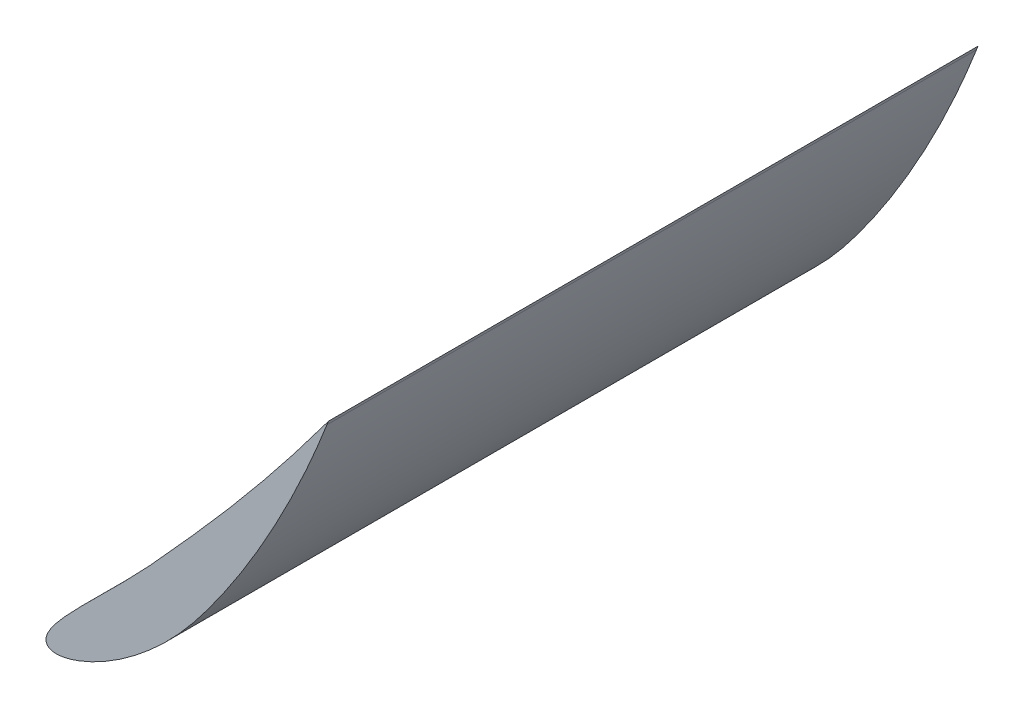
ISO-10303-21;
HEADER;
FILE_DESCRIPTION(('STEP AP214'),'2;1');
FILE_NAME('part.step','',(''),(''),'','','');
FILE_SCHEMA(('AUTOMOTIVE_DESIGN { 1 0 10303 214 1 1 1 1 }'));
ENDSEC;
DATA;
#1=APPLICATION_CONTEXT('core data for automotive mechanical design processes');
#2=APPLICATION_PROTOCOL_DEFINITION('international standard','automotive_design',2000,#1);
#3=PRODUCT_CONTEXT('',#1,'mechanical');
#4=PRODUCT('Part','Part','',(#3));
#5=PRODUCT_RELATED_PRODUCT_CATEGORY('part','',(#4));
#6=PRODUCT_DEFINITION_FORMATION('','',#4);
#7=PRODUCT_DEFINITION_CONTEXT('part definition',#1,'design');
#8=PRODUCT_DEFINITION('design','',#6,#7);
#9=PRODUCT_DEFINITION_SHAPE('','',#8);
#10=(LENGTH_UNIT() NAMED_UNIT(*) SI_UNIT(.MILLI.,.METRE.));
#11=(NAMED_UNIT(*) PLANE_ANGLE_UNIT() SI_UNIT($,.RADIAN.));
#12=(NAMED_UNIT(*) SI_UNIT($,.STERADIAN.) SOLID_ANGLE_UNIT());
#13=UNCERTAINTY_MEASURE_WITH_UNIT(LENGTH_MEASURE(1.E-05),#10,'distance_accuracy_value','');
#14=(GEOMETRIC_REPRESENTATION_CONTEXT(3) GLOBAL_UNCERTAINTY_ASSIGNED_CONTEXT((#13)) GLOBAL_UNIT_ASSIGNED_CONTEXT((#10,
#11,#12)) REPRESENTATION_CONTEXT('',''));
#15=CARTESIAN_POINT('',(0.,0.,0.));
#16=DIRECTION('',(0.,0.,1.));
#17=DIRECTION('',(1.,0.,0.));
#18=AXIS2_PLACEMENT_3D('',#15,#16,#17);
#19=CARTESIAN_POINT('',(97.8137332136656,116.86860343058,228.6));
#20=CARTESIAN_POINT('',(97.7669992183084,116.805627113996,228.6));
#21=CARTESIAN_POINT('',(97.5803130026046,116.554058419059,228.6));
#22=CARTESIAN_POINT('',(97.1607888126259,115.989952744268,228.6));
#23=CARTESIAN_POINT('',(96.4639961396961,115.054026865066,228.6));
#24=CARTESIAN_POINT('',(95.4924542969306,113.753595867812,228.6));
#25=CARTESIAN_POINT('',(94.2504202583417,112.098040238544,228.6));
#26=CARTESIAN_POINT('',(92.7432066996339,110.099612909975,228.6));
#27=CARTESIAN_POINT('',(90.9767786409202,107.773302857194,228.6));
#28=CARTESIAN_POINT('',(88.9590425455821,105.13610890942,228.6));
#29=CARTESIAN_POINT('',(86.6981707568239,102.207726841175,228.6));
#30=CARTESIAN_POINT('',(84.2043740518763,99.0094529713091,228.6));
#31=CARTESIAN_POINT('',(81.4879419079242,95.565167312813,228.6));
#32=CARTESIAN_POINT('',(78.5616527284862,91.8994504311578,228.6));
#33=CARTESIAN_POINT('',(75.4390835388548,88.0386280973165,228.6));
#34=CARTESIAN_POINT('',(72.135956401896,84.0095087757725,228.6));
#35=CARTESIAN_POINT('',(68.6688047216238,79.8401309149492,228.6));
#36=CARTESIAN_POINT('',(65.0573201930824,75.5576970940226,228.6));
#37=CARTESIAN_POINT('',(61.3219555140707,71.190023639292,228.6));
#38=CARTESIAN_POINT('',(57.4858546977625,66.7641429466457,228.6));
#39=CARTESIAN_POINT('',(53.5742219118697,62.3058591382801,228.6));
#40=CARTESIAN_POINT('',(49.6131051147125,57.8411879676059,228.6));
#41=CARTESIAN_POINT('',(45.6322591512687,53.3930893948024,228.6));
#42=CARTESIAN_POINT('',(41.6581598168508,48.9874868580185,228.6));
#43=CARTESIAN_POINT('',(37.7324465764052,44.6347432817589,228.6));
#44=CARTESIAN_POINT('',(33.8059814126913,40.4269731275683,228.6));
#45=CARTESIAN_POINT('',(29.9195610664221,36.3755477990785,228.6));
#46=CARTESIAN_POINT('',(26.1101536055358,32.4940809014098,228.6));
#47=CARTESIAN_POINT('',(22.4167278468271,28.7935103404381,228.6));
#48=CARTESIAN_POINT('',(18.8777043655426,25.2834160077278,228.6));
#49=CARTESIAN_POINT('',(15.5312873300869,21.9715325768351,228.6));
#50=CARTESIAN_POINT('',(12.4136528103556,18.8650991681408,228.6));
#51=CARTESIAN_POINT('',(9.55974300948811,15.9697374300727,228.6));
#52=CARTESIAN_POINT('',(7.00077432910496,13.2915183648732,228.6));
#53=CARTESIAN_POINT('',(4.76616148462841,10.8348916844291,228.6));
#54=CARTESIAN_POINT('',(2.88073522590203,8.60445058371188,228.6));
#55=CARTESIAN_POINT('',(1.36554493937061,6.60374765790339,228.6));
#56=CARTESIAN_POINT('',(0.236182588741622,4.83424953486331,228.6));
#57=CARTESIAN_POINT('',(-0.495963941615334,3.29145994512534,228.6));
#58=CARTESIAN_POINT('',(-0.826333115795017,1.9584743241363,228.6));
#59=CARTESIAN_POINT('',(-0.694809938298505,0.792786703510852,228.6));
#60=CARTESIAN_POINT('',(-0.0160813713409521,-0.0981649626573972,228.6));
#61=CARTESIAN_POINT('',(1.07585694611111,-0.630099093502898,228.6));
#62=CARTESIAN_POINT('',(2.50794565187337,-0.84109171326829,228.6));
#63=CARTESIAN_POINT('',(4.27814833721603,-0.759421478664957,228.6));
#64=CARTESIAN_POINT('',(6.38579866183101,-0.384068927977449,228.6));
#65=CARTESIAN_POINT('',(8.81693628628207,0.290663380890077,228.6));
#66=CARTESIAN_POINT('',(11.5478362976383,1.27357542980017,228.6));
#67=CARTESIAN_POINT('',(14.5495578740381,2.57081595112599,228.6));
#68=CARTESIAN_POINT('',(17.7884314196016,4.18919057714553,228.6));
#69=CARTESIAN_POINT('',(21.2285346552186,6.13293180113872,228.6));
#70=CARTESIAN_POINT('',(24.8318117752578,8.40485229218982,228.6));
#71=CARTESIAN_POINT('',(28.5591963302505,11.0056857780069,228.6));
#72=CARTESIAN_POINT('',(32.3720543770746,13.9325804086768,228.6));
#73=CARTESIAN_POINT('',(36.2318466938443,17.1803834063919,228.6));
#74=CARTESIAN_POINT('',(40.1019091761925,20.7397133609309,228.6));
#75=CARTESIAN_POINT('',(43.9471804100853,24.5980510472107,228.6));
#76=CARTESIAN_POINT('',(47.7349891146487,28.7388033018524,228.6));
#77=CARTESIAN_POINT('',(51.4364840361321,33.1411797641945,228.6));
#78=CARTESIAN_POINT('',(55.0189078093856,37.7816381036581,228.6));
#79=CARTESIAN_POINT('',(58.5472398557344,42.5631470763992,228.6));
#80=CARTESIAN_POINT('',(61.991116763375,47.4634143463883,228.6));
#81=CARTESIAN_POINT('',(65.3365248146767,52.4460022002043,228.6));
#82=CARTESIAN_POINT('',(68.5669409219207,57.4767198642199,228.6));
#83=CARTESIAN_POINT('',(71.6693015705271,62.5188811781721,228.6));
#84=CARTESIAN_POINT('',(74.6304526730013,67.5364407267787,228.6));
#85=CARTESIAN_POINT('',(77.4395059683986,72.4921523557111,228.6));
#86=CARTESIAN_POINT('',(80.087304420646,77.3488244464799,228.6));
#87=CARTESIAN_POINT('',(82.5655590057878,82.0696260791285,228.6));
#88=CARTESIAN_POINT('',(84.8681215038335,86.6179564539699,228.6));
#89=CARTESIAN_POINT('',(86.9893839299676,90.9583718773948,228.6));
#90=CARTESIAN_POINT('',(88.9259407005482,95.056088101909,228.6));
#91=CARTESIAN_POINT('',(90.6758095415655,98.8776612718666,228.6));
#92=CARTESIAN_POINT('',(92.2371976177409,102.391824454854,228.6));
#93=CARTESIAN_POINT('',(93.6103190532152,105.568768693889,228.6));
#94=CARTESIAN_POINT('',(94.7958202235989,108.381383030425,228.6));
#95=CARTESIAN_POINT('',(95.794855225195,110.80513563709,228.6));
#96=CARTESIAN_POINT('',(96.6090036132774,112.818724881819,228.6));
#97=CARTESIAN_POINT('',(97.2400379340367,114.404059770635,228.6));
#98=CARTESIAN_POINT('',(97.6892738023378,115.547006234183,228.6));
#99=CARTESIAN_POINT('',(97.9585585127539,116.23685124781,228.6));
#100=CARTESIAN_POINT('',(98.078015040344,116.544659288396,228.6));
#101=CARTESIAN_POINT('',(98.1079302187929,116.621742832084,228.6));
#102=B_SPLINE_CURVE_WITH_KNOTS('',3,(#19,#20,#21,#22,#23,#24,#25,#26,#27,#28,#29,#30,#31,#32,
#33,#34,#35,#36,#37,#38,#39,#40,#41,#42,#43,#44,#45,#46,#47,#48,#49,#50,#51,#52,#53,#54,#55,#56,
#57,#58,#59,#60,#61,#62,#63,#64,#65,#66,#67,#68,#69,#70,#71,#72,#73,#74,#75,#76,#77,#78,#79,#80,
#81,#82,#83,#84,#85,#86,#87,#88,#89,#90,#91,#92,#93,#94,#95,#96,#97,#98,#99,#100,#101),
.UNSPECIFIED.,.F.,.F.,(4,1,1,1,1,1,1,1,1,1,1,1,1,1,1,1,1,1,1,1,1,1,1,1,1,1,1,1,1,1,1,1,1,1,1,1,
1,1,1,1,1,1,1,1,1,1,1,1,1,1,1,1,1,1,1,1,1,1,1,1,1,1,1,1,1,1,1,1,1,1,1,1,1,1,1,1,1,1,1,1,4),(0.,
0.000750513501971195,0.00299804295428685,0.00672784940377236,0.0119171706525508,
0.0185329713263098,0.026534805613309,0.0358719389384909,0.0464868619139933,0.0583128283132623,
0.0712773849994469,0.0852994283936014,0.100292782778247,0.116165673834452,0.132819784938735,
0.150153116370067,0.168060493162749,0.18643095732459,0.205153508431755,0.224112105695577,
0.243191419595248,0.262273248918981,0.281238994312411,0.299973133201852,0.318367875682616,
0.336314444831389,0.353699728178519,0.370414229508711,0.386350073996083,0.401402198899796,
0.415472291888822,0.428468847070347,0.440308267572275,0.450919872749776,0.460245935875565,
0.468249663818777,0.47492187606895,0.480303629236668,0.484529405053291,0.487929891183724,
0.49113735242087,0.494782629666708,0.49927184258141,0.504867269579987,0.511674811850919,
0.519719915105306,0.528985613085521,0.539430032020974,0.550996930431098,0.563619975082369,
0.577228754188619,0.591747770545967,0.607101620883268,0.623214138669307,0.640007660113029,
0.657405010167299,0.675329003903349,0.693698678149423,0.712431881974785,0.731423114535592,
0.750564737004094,0.769745998457317,0.788854221163154,0.807776971836167,0.826399187090761,
0.844608489708695,0.862290408781229,0.879334612387501,0.895632214479611,0.911076793640884,
0.925566896965723,0.939005567967945,0.951300576603228,0.962367399370791,0.972127178235692,
0.9805106388094,0.987455983158366,0.992912933292426,0.996840179326193,0.999208694566608,1.),.UNSPECIFIED.);
#103=DIRECTION('',(0.,0.,-1.));
#104=VECTOR('',#103,1.);
#105=SURFACE_OF_LINEAR_EXTRUSION('',#102,#104);
#106=CARTESIAN_POINT('',(97.8137332136656,116.86860343058,0.));
#107=CARTESIAN_POINT('',(97.7669992183084,116.805627113996,0.));
#108=CARTESIAN_POINT('',(97.5803130026046,116.554058419059,0.));
#109=CARTESIAN_POINT('',(97.1607888126259,115.989952744268,0.));
#110=CARTESIAN_POINT('',(96.4639961396961,115.054026865066,0.));
#111=CARTESIAN_POINT('',(95.4924542969306,113.753595867812,0.));
#112=CARTESIAN_POINT('',(94.2504202583417,112.098040238544,0.));
#113=CARTESIAN_POINT('',(92.7432066996339,110.099612909975,0.));
#114=CARTESIAN_POINT('',(90.9767786409202,107.773302857194,0.));
#115=CARTESIAN_POINT('',(88.9590425455821,105.13610890942,0.));
#116=CARTESIAN_POINT('',(86.6981707568239,102.207726841175,0.));
#117=CARTESIAN_POINT('',(84.2043740518763,99.0094529713091,0.));
#118=CARTESIAN_POINT('',(81.4879419079242,95.565167312813,0.));
#119=CARTESIAN_POINT('',(78.5616527284862,91.8994504311578,0.));
#120=CARTESIAN_POINT('',(75.4390835388548,88.0386280973165,0.));
#121=CARTESIAN_POINT('',(72.135956401896,84.0095087757725,0.));
#122=CARTESIAN_POINT('',(68.6688047216238,79.8401309149492,0.));
#123=CARTESIAN_POINT('',(65.0573201930824,75.5576970940226,0.));
#124=CARTESIAN_POINT('',(61.3219555140707,71.190023639292,0.));
#125=CARTESIAN_POINT('',(57.4858546977625,66.7641429466457,0.));
#126=CARTESIAN_POINT('',(53.5742219118697,62.3058591382801,0.));
#127=CARTESIAN_POINT('',(49.6131051147125,57.8411879676059,0.));
#128=CARTESIAN_POINT('',(45.6322591512687,53.3930893948024,0.));
#129=CARTESIAN_POINT('',(41.6581598168508,48.9874868580185,0.));
#130=CARTESIAN_POINT('',(37.7324465764052,44.6347432817589,0.));
#131=CARTESIAN_POINT('',(33.8059814126913,40.4269731275683,0.));
#132=CARTESIAN_POINT('',(29.9195610664221,36.3755477990785,0.));
#133=CARTESIAN_POINT('',(26.1101536055358,32.4940809014098,0.));
#134=CARTESIAN_POINT('',(22.4167278468271,28.7935103404381,0.));
#135=CARTESIAN_POINT('',(18.8777043655426,25.2834160077278,0.));
#136=CARTESIAN_POINT('',(15.5312873300869,21.9715325768351,0.));
#137=CARTESIAN_POINT('',(12.4136528103556,18.8650991681408,0.));
#138=CARTESIAN_POINT('',(9.55974300948811,15.9697374300727,0.));
#139=CARTESIAN_POINT('',(7.00077432910496,13.2915183648732,0.));
#140=CARTESIAN_POINT('',(4.76616148462841,10.8348916844291,0.));
#141=CARTESIAN_POINT('',(2.88073522590203,8.60445058371188,0.));
#142=CARTESIAN_POINT('',(1.36554493937061,6.60374765790339,0.));
#143=CARTESIAN_POINT('',(0.236182588741622,4.83424953486331,0.));
#144=CARTESIAN_POINT('',(-0.495963941615334,3.29145994512534,0.));
#145=CARTESIAN_POINT('',(-0.826333115795017,1.9584743241363,0.));
#146=CARTESIAN_POINT('',(-0.694809938298505,0.792786703510852,0.));
#147=CARTESIAN_POINT('',(-0.0160813713409521,-0.0981649626573972,0.));
#148=CARTESIAN_POINT('',(1.07585694611111,-0.630099093502898,0.));
#149=CARTESIAN_POINT('',(2.50794565187337,-0.84109171326829,0.));
#150=CARTESIAN_POINT('',(4.27814833721603,-0.759421478664957,0.));
#151=CARTESIAN_POINT('',(6.38579866183101,-0.384068927977449,0.));
#152=CARTESIAN_POINT('',(8.81693628628207,0.290663380890077,0.));
#153=CARTESIAN_POINT('',(11.5478362976383,1.27357542980017,0.));
#154=CARTESIAN_POINT('',(14.5495578740381,2.57081595112599,0.));
#155=CARTESIAN_POINT('',(17.7884314196016,4.18919057714553,0.));
#156=CARTESIAN_POINT('',(21.2285346552186,6.13293180113872,0.));
#157=CARTESIAN_POINT('',(24.8318117752578,8.40485229218982,0.));
#158=CARTESIAN_POINT('',(28.5591963302505,11.0056857780069,0.));
#159=CARTESIAN_POINT('',(32.3720543770746,13.9325804086768,0.));
#160=CARTESIAN_POINT('',(36.2318466938443,17.1803834063919,0.));
#161=CARTESIAN_POINT('',(40.1019091761925,20.7397133609309,0.));
#162=CARTESIAN_POINT('',(43.9471804100853,24.5980510472107,0.));
#163=CARTESIAN_POINT('',(47.7349891146487,28.7388033018524,0.));
#164=CARTESIAN_POINT('',(51.4364840361321,33.1411797641945,0.));
#165=CARTESIAN_POINT('',(55.0189078093856,37.7816381036581,0.));
#166=CARTESIAN_POINT('',(58.5472398557344,42.5631470763992,0.));
#167=CARTESIAN_POINT('',(61.991116763375,47.4634143463883,0.));
#168=CARTESIAN_POINT('',(65.3365248146767,52.4460022002043,0.));
#169=CARTESIAN_POINT('',(68.5669409219207,57.4767198642199,0.));
#170=CARTESIAN_POINT('',(71.6693015705271,62.5188811781721,0.));
#171=CARTESIAN_POINT('',(74.6304526730013,67.5364407267787,0.));
#172=CARTESIAN_POINT('',(77.4395059683986,72.4921523557111,0.));
#173=CARTESIAN_POINT('',(80.087304420646,77.3488244464799,0.));
#174=CARTESIAN_POINT('',(82.5655590057878,82.0696260791285,0.));
#175=CARTESIAN_POINT('',(84.8681215038335,86.6179564539699,0.));
#176=CARTESIAN_POINT('',(86.9893839299676,90.9583718773948,0.));
#177=CARTESIAN_POINT('',(88.9259407005482,95.056088101909,0.));
#178=CARTESIAN_POINT('',(90.6758095415655,98.8776612718666,0.));
#179=CARTESIAN_POINT('',(92.2371976177409,102.391824454854,0.));
#180=CARTESIAN_POINT('',(93.6103190532152,105.568768693889,0.));
#181=CARTESIAN_POINT('',(94.7958202235989,108.381383030425,0.));
#182=CARTESIAN_POINT('',(95.794855225195,110.80513563709,0.));
#183=CARTESIAN_POINT('',(96.6090036132774,112.818724881819,0.));
#184=CARTESIAN_POINT('',(97.2400379340367,114.404059770635,0.));
#185=CARTESIAN_POINT('',(97.6892738023378,115.547006234183,0.));
#186=CARTESIAN_POINT('',(97.9585585127539,116.23685124781,0.));
#187=CARTESIAN_POINT('',(98.078015040344,116.544659288396,0.));
#188=CARTESIAN_POINT('',(98.1079302187929,116.621742832084,0.));
#189=B_SPLINE_CURVE_WITH_KNOTS('',3,(#106,#107,#108,#109,#110,#111,#112,#113,#114,#115,#116,
#117,#118,#119,#120,#121,#122,#123,#124,#125,#126,#127,#128,#129,#130,#131,#132,#133,#134,#135,
#136,#137,#138,#139,#140,#141,#142,#143,#144,#145,#146,#147,#148,#149,#150,#151,#152,#153,#154,
#155,#156,#157,#158,#159,#160,#161,#162,#163,#164,#165,#166,#167,#168,#169,#170,#171,#172,#173,
#174,#175,#176,#177,#178,#179,#180,#181,#182,#183,#184,#185,#186,#187,#188),.UNSPECIFIED.,.F.,
.F.,(4,1,1,1,1,1,1,1,1,1,1,1,1,1,1,1,1,1,1,1,1,1,1,1,1,1,1,1,1,1,1,1,1,1,1,1,1,1,1,1,1,1,1,1,1,
1,1,1,1,1,1,1,1,1,1,1,1,1,1,1,1,1,1,1,1,1,1,1,1,1,1,1,1,1,1,1,1,1,1,1,4),(0.,
0.000750513501971195,0.00299804295428685,0.00672784940377236,0.0119171706525508,
0.0185329713263098,0.026534805613309,0.0358719389384909,0.0464868619139933,0.0583128283132623,
0.0712773849994469,0.0852994283936014,0.100292782778247,0.116165673834452,0.132819784938735,
0.150153116370067,0.168060493162749,0.18643095732459,0.205153508431755,0.224112105695577,
0.243191419595248,0.262273248918981,0.281238994312411,0.299973133201852,0.318367875682616,
0.336314444831389,0.353699728178519,0.370414229508711,0.386350073996083,0.401402198899796,
0.415472291888822,0.428468847070347,0.440308267572275,0.450919872749776,0.460245935875565,
0.468249663818777,0.47492187606895,0.480303629236668,0.484529405053291,0.487929891183724,
0.49113735242087,0.494782629666708,0.49927184258141,0.504867269579987,0.511674811850919,
0.519719915105306,0.528985613085521,0.539430032020974,0.550996930431098,0.563619975082369,
0.577228754188619,0.591747770545967,0.607101620883268,0.623214138669307,0.640007660113029,
0.657405010167299,0.675329003903349,0.693698678149423,0.712431881974785,0.731423114535592,
0.750564737004094,0.769745998457317,0.788854221163154,0.807776971836167,0.826399187090761,
0.844608489708695,0.862290408781229,0.879334612387501,0.895632214479611,0.911076793640884,
0.925566896965723,0.939005567967945,0.951300576603228,0.962367399370791,0.972127178235692,
0.9805106388094,0.987455983158366,0.992912933292426,0.996840179326193,0.999208694566608,1.),.UNSPECIFIED.);
#190=CARTESIAN_POINT('',(97.8137332136656,116.86860343058,0.));
#191=VERTEX_POINT('',#190);
#192=CARTESIAN_POINT('',(98.1079302187928,116.621742832084,0.));
#193=VERTEX_POINT('',#192);
#194=EDGE_CURVE('E80',#191,#193,#189,.T.);
#195=ORIENTED_EDGE('',*,*,#194,.T.);
#196=DIRECTION('',(0.,0.,-1.));
#197=VECTOR('',#196,1.);
#198=CARTESIAN_POINT('',(98.1079302187928,116.621742832084,228.6));
#199=LINE('',#198,#197);
#200=CARTESIAN_POINT('',(98.1079302187928,116.621742832084,228.6));
#201=VERTEX_POINT('',#200);
#202=EDGE_CURVE('E11',#201,#193,#199,.T.);
#203=ORIENTED_EDGE('',*,*,#202,.F.);
#204=CARTESIAN_POINT('',(97.8137332136656,116.86860343058,228.6));
#205=VERTEX_POINT('',#204);
#206=EDGE_CURVE('E74',#205,#201,#102,.T.);
#207=ORIENTED_EDGE('',*,*,#206,.F.);
#208=DIRECTION('',(0.,0.,-1.));
#209=VECTOR('',#208,1.);
#210=CARTESIAN_POINT('',(97.8137332136656,116.86860343058,228.6));
#211=LINE('',#210,#209);
#212=EDGE_CURVE('E81',#205,#191,#211,.T.);
#213=ORIENTED_EDGE('',*,*,#212,.T.);
#214=EDGE_LOOP('',(#195,#203,#207,#213));
#215=FACE_BOUND('',#214,.T.);
#216=ADVANCED_FACE('F33',(#215),#105,.F.);
#217=CARTESIAN_POINT('',(98.1079302187928,116.621742832084,228.6));
#218=DIRECTION('',(-0.93225674104336,0.361797414002938,0.));
#219=DIRECTION('',(-0.361797414002938,-0.93225674104336,0.));
#220=AXIS2_PLACEMENT_3D('',#217,#218,#219);
#221=PLANE('',#220);
#222=DIRECTION('',(0.361797414002938,0.93225674104336,0.));
#223=VECTOR('',#222,1.);
#224=CARTESIAN_POINT('',(98.1079302187928,116.621742832084,0.));
#225=LINE('',#224,#223);
#226=CARTESIAN_POINT('',(98.6312878967818,117.97029786426,0.));
#227=VERTEX_POINT('',#226);
#228=EDGE_CURVE('E62',#193,#227,#225,.T.);
#229=ORIENTED_EDGE('',*,*,#228,.T.);
#230=DIRECTION('',(0.,0.,-1.));
#231=VECTOR('',#230,1.);
#232=CARTESIAN_POINT('',(98.6312878967818,117.97029786426,228.6));
#233=LINE('',#232,#231);
#234=CARTESIAN_POINT('',(98.6312878967818,117.97029786426,228.6));
#235=VERTEX_POINT('',#234);
#236=EDGE_CURVE('E42',#235,#227,#233,.T.);
#237=ORIENTED_EDGE('',*,*,#236,.F.);
#238=DIRECTION('',(0.361797414002938,0.93225674104336,0.));
#239=VECTOR('',#238,1.);
#240=CARTESIAN_POINT('',(98.1079302187928,116.621742832084,228.6));
#241=LINE('',#240,#239);
#242=EDGE_CURVE('E70',#201,#235,#241,.T.);
#243=ORIENTED_EDGE('',*,*,#242,.F.);
#244=ORIENTED_EDGE('',*,*,#202,.T.);
#245=EDGE_LOOP('',(#229,#237,#243,#244));
#246=FACE_BOUND('',#245,.T.);
#247=ADVANCED_FACE('F71',(#246),#221,.F.);
#248=CARTESIAN_POINT('',(97.8137332136656,116.86860343058,228.6));
#249=DIRECTION('',(0.803039254555457,-0.595926132706912,0.));
#250=DIRECTION('',(0.595926132706912,0.803039254555457,0.));
#251=AXIS2_PLACEMENT_3D('',#248,#249,#250);
#252=PLANE('',#251);
#253=DIRECTION('',(-0.595926132706912,-0.803039254555457,0.));
#254=VECTOR('',#253,1.);
#255=CARTESIAN_POINT('',(97.8137332136656,116.86860343058,0.));
#256=LINE('',#255,#254);
#257=EDGE_CURVE('E67',#227,#191,#256,.T.);
#258=ORIENTED_EDGE('',*,*,#257,.T.);
#259=ORIENTED_EDGE('',*,*,#212,.F.);
#260=DIRECTION('',(-0.595926132706912,-0.803039254555457,0.));
#261=VECTOR('',#260,1.);
#262=CARTESIAN_POINT('',(97.8137332136656,116.86860343058,228.6));
#263=LINE('',#262,#261);
#264=EDGE_CURVE('E50',#235,#205,#263,.T.);
#265=ORIENTED_EDGE('',*,*,#264,.F.);
#266=ORIENTED_EDGE('',*,*,#236,.T.);
#267=EDGE_LOOP('',(#258,#259,#265,#266));
#268=FACE_BOUND('',#267,.T.);
#269=ADVANCED_FACE('F93',(#268),#252,.F.);
#270=CARTESIAN_POINT('',(2.62193246068951,-0.794521372297344,228.6));
#271=DIRECTION('',(0.,0.,1.));
#272=DIRECTION('',(1.,0.,0.));
#273=AXIS2_PLACEMENT_3D('',#270,#271,#272);
#274=PLANE('',#273);
#275=ORIENTED_EDGE('',*,*,#206,.T.);
#276=ORIENTED_EDGE('',*,*,#242,.T.);
#277=ORIENTED_EDGE('',*,*,#264,.T.);
#278=EDGE_LOOP('',(#275,#276,#277));
#279=FACE_BOUND('',#278,.T.);
#280=ADVANCED_FACE('F77',(#279),#274,.T.);
#281=CARTESIAN_POINT('',(2.62193246068951,-0.794521372297344,0.));
#282=DIRECTION('',(0.,0.,1.));
#283=DIRECTION('',(1.,0.,0.));
#284=AXIS2_PLACEMENT_3D('',#281,#282,#283);
#285=PLANE('',#284);
#286=ORIENTED_EDGE('',*,*,#194,.F.);
#287=ORIENTED_EDGE('',*,*,#257,.F.);
#288=ORIENTED_EDGE('',*,*,#228,.F.);
#289=EDGE_LOOP('',(#286,#287,#288));
#290=FACE_BOUND('',#289,.T.);
#291=ADVANCED_FACE('F94',(#290),#285,.F.);
#292=CLOSED_SHELL('',(#216,#247,#269,#280,#291));
#293=MANIFOLD_SOLID_BREP('B2',#292);
#294=ADVANCED_BREP_SHAPE_REPRESENTATION('',(#18,#293),#14);
#295=SHAPE_DEFINITION_REPRESENTATION(#9,#294);
ENDSEC;
END-ISO-10303-21;
